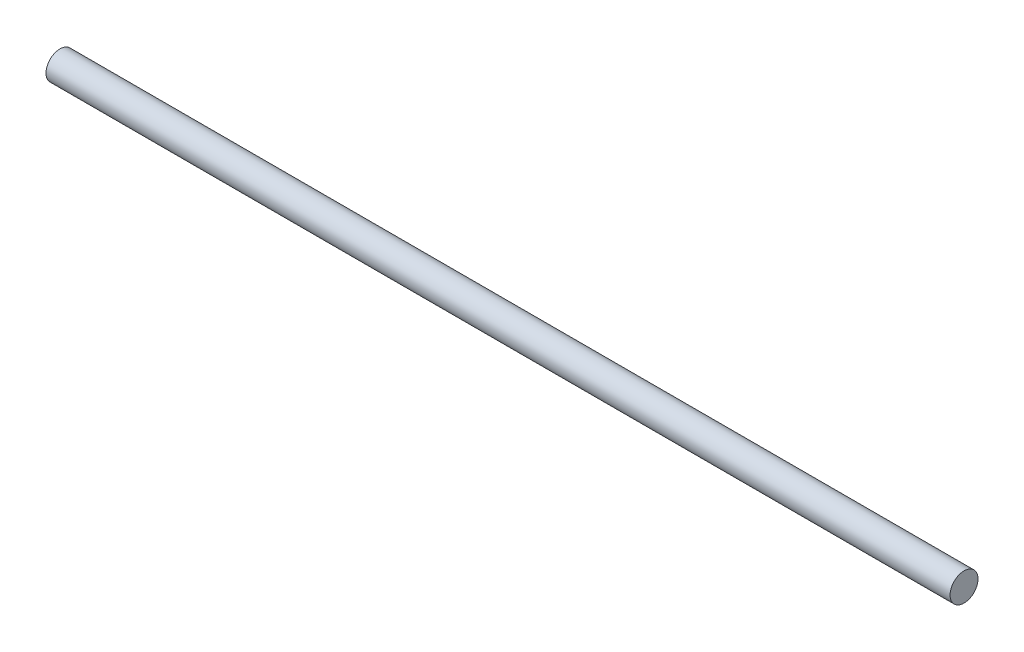
ISO-10303-21;
HEADER;
FILE_DESCRIPTION(('STEP AP214'),'2;1');
FILE_NAME('part.step','',(''),(''),'','','');
FILE_SCHEMA(('AUTOMOTIVE_DESIGN { 1 0 10303 214 1 1 1 1 }'));
ENDSEC;
DATA;
#1=APPLICATION_CONTEXT('core data for automotive mechanical design processes');
#2=APPLICATION_PROTOCOL_DEFINITION('international standard','automotive_design',2000,#1);
#3=PRODUCT_CONTEXT('',#1,'mechanical');
#4=PRODUCT('Part','Part','',(#3));
#5=PRODUCT_RELATED_PRODUCT_CATEGORY('part','',(#4));
#6=PRODUCT_DEFINITION_FORMATION('','',#4);
#7=PRODUCT_DEFINITION_CONTEXT('part definition',#1,'design');
#8=PRODUCT_DEFINITION('design','',#6,#7);
#9=PRODUCT_DEFINITION_SHAPE('','',#8);
#10=(LENGTH_UNIT() NAMED_UNIT(*) SI_UNIT(.MILLI.,.METRE.));
#11=(NAMED_UNIT(*) PLANE_ANGLE_UNIT() SI_UNIT($,.RADIAN.));
#12=(NAMED_UNIT(*) SI_UNIT($,.STERADIAN.) SOLID_ANGLE_UNIT());
#13=UNCERTAINTY_MEASURE_WITH_UNIT(LENGTH_MEASURE(1.E-05),#10,'distance_accuracy_value','');
#14=(GEOMETRIC_REPRESENTATION_CONTEXT(3) GLOBAL_UNCERTAINTY_ASSIGNED_CONTEXT((#13)) GLOBAL_UNIT_ASSIGNED_CONTEXT((#10,
#11,#12)) REPRESENTATION_CONTEXT('',''));
#15=CARTESIAN_POINT('',(0.,0.,0.));
#16=DIRECTION('',(0.,0.,1.));
#17=DIRECTION('',(1.,0.,0.));
#18=AXIS2_PLACEMENT_3D('',#15,#16,#17);
#19=CARTESIAN_POINT('',(97.,0.,0.));
#20=DIRECTION('',(-1.,0.,0.));
#21=DIRECTION('',(0.,0.,1.));
#22=AXIS2_PLACEMENT_3D('',#19,#20,#21);
#23=CYLINDRICAL_SURFACE('',#22,1.5);
#24=CARTESIAN_POINT('',(97.,0.,0.));
#25=DIRECTION('',(1.,0.,0.));
#26=DIRECTION('',(0.,0.,-1.));
#27=AXIS2_PLACEMENT_3D('',#24,#25,#26);
#28=CIRCLE('',#27,1.5);
#29=CARTESIAN_POINT('',(97.,0.,1.5));
#30=VERTEX_POINT('',#29);
#31=EDGE_CURVE('E10',#30,#30,#28,.T.);
#32=CARTESIAN_POINT('',(0.,0.,0.));
#33=DIRECTION('',(1.,0.,0.));
#34=DIRECTION('',(0.,0.,-1.));
#35=AXIS2_PLACEMENT_3D('',#32,#33,#34);
#36=CIRCLE('',#35,1.5);
#37=CARTESIAN_POINT('',(0.,0.,1.5));
#38=VERTEX_POINT('',#37);
#39=EDGE_CURVE('E34',#38,#38,#36,.T.);
#40=CARTESIAN_POINT('',(97.,0.,1.5));
#41=CARTESIAN_POINT('',(95.9895833333333,0.,1.5));
#42=CARTESIAN_POINT('',(94.9791666666667,0.,1.5));
#43=CARTESIAN_POINT('',(92.9583333333333,0.,1.5));
#44=CARTESIAN_POINT('',(91.9479166666667,0.,1.5));
#45=CARTESIAN_POINT('',(89.9270833333333,0.,1.5));
#46=CARTESIAN_POINT('',(88.9166666666667,0.,1.5));
#47=CARTESIAN_POINT('',(86.8958333333333,0.,1.5));
#48=CARTESIAN_POINT('',(85.8854166666667,0.,1.5));
#49=CARTESIAN_POINT('',(83.8645833333333,0.,1.5));
#50=CARTESIAN_POINT('',(82.8541666666667,0.,1.5));
#51=CARTESIAN_POINT('',(80.8333333333333,0.,1.5));
#52=CARTESIAN_POINT('',(79.8229166666667,0.,1.5));
#53=CARTESIAN_POINT('',(77.8020833333333,0.,1.5));
#54=CARTESIAN_POINT('',(76.7916666666667,0.,1.5));
#55=CARTESIAN_POINT('',(74.7708333333333,0.,1.5));
#56=CARTESIAN_POINT('',(73.7604166666667,0.,1.5));
#57=CARTESIAN_POINT('',(71.7395833333333,0.,1.5));
#58=CARTESIAN_POINT('',(70.7291666666667,0.,1.5));
#59=CARTESIAN_POINT('',(68.7083333333333,0.,1.5));
#60=CARTESIAN_POINT('',(67.6979166666666,0.,1.5));
#61=CARTESIAN_POINT('',(65.6770833333333,0.,1.5));
#62=CARTESIAN_POINT('',(64.6666666666667,0.,1.5));
#63=CARTESIAN_POINT('',(62.6458333333333,0.,1.5));
#64=CARTESIAN_POINT('',(61.6354166666667,0.,1.5));
#65=CARTESIAN_POINT('',(59.6145833333333,0.,1.5));
#66=CARTESIAN_POINT('',(58.6041666666667,0.,1.5));
#67=CARTESIAN_POINT('',(56.5833333333333,0.,1.5));
#68=CARTESIAN_POINT('',(55.5729166666667,0.,1.5));
#69=CARTESIAN_POINT('',(53.5520833333333,0.,1.5));
#70=CARTESIAN_POINT('',(52.5416666666667,0.,1.5));
#71=CARTESIAN_POINT('',(50.5208333333333,0.,1.5));
#72=CARTESIAN_POINT('',(49.5104166666667,0.,1.5));
#73=CARTESIAN_POINT('',(47.4895833333333,0.,1.5));
#74=CARTESIAN_POINT('',(46.4791666666667,0.,1.5));
#75=CARTESIAN_POINT('',(44.4583333333333,0.,1.5));
#76=CARTESIAN_POINT('',(43.4479166666667,0.,1.5));
#77=CARTESIAN_POINT('',(41.4270833333333,0.,1.5));
#78=CARTESIAN_POINT('',(40.4166666666667,0.,1.5));
#79=CARTESIAN_POINT('',(38.3958333333333,0.,1.5));
#80=CARTESIAN_POINT('',(37.3854166666667,0.,1.5));
#81=CARTESIAN_POINT('',(35.3645833333333,0.,1.5));
#82=CARTESIAN_POINT('',(34.3541666666667,0.,1.5));
#83=CARTESIAN_POINT('',(32.3333333333333,0.,1.5));
#84=CARTESIAN_POINT('',(31.3229166666667,0.,1.5));
#85=CARTESIAN_POINT('',(29.3020833333333,0.,1.5));
#86=CARTESIAN_POINT('',(28.2916666666667,0.,1.5));
#87=CARTESIAN_POINT('',(26.2708333333333,0.,1.5));
#88=CARTESIAN_POINT('',(25.2604166666667,0.,1.5));
#89=CARTESIAN_POINT('',(23.2395833333333,0.,1.5));
#90=CARTESIAN_POINT('',(22.2291666666667,0.,1.5));
#91=CARTESIAN_POINT('',(20.2083333333333,0.,1.5));
#92=CARTESIAN_POINT('',(19.1979166666667,0.,1.5));
#93=CARTESIAN_POINT('',(17.1770833333333,0.,1.5));
#94=CARTESIAN_POINT('',(16.1666666666667,0.,1.5));
#95=CARTESIAN_POINT('',(14.1458333333333,0.,1.5));
#96=CARTESIAN_POINT('',(13.1354166666667,0.,1.5));
#97=CARTESIAN_POINT('',(11.1145833333333,0.,1.5));
#98=CARTESIAN_POINT('',(10.1041666666667,0.,1.5));
#99=CARTESIAN_POINT('',(8.08333333333332,0.,1.5));
#100=CARTESIAN_POINT('',(7.07291666666665,0.,1.5));
#101=CARTESIAN_POINT('',(5.05208333333332,0.,1.5));
#102=CARTESIAN_POINT('',(4.04166666666665,0.,1.5));
#103=CARTESIAN_POINT('',(2.02083333333332,0.,1.5));
#104=CARTESIAN_POINT('',(1.01041666666665,0.,1.5));
#105=CARTESIAN_POINT('',(0.,0.,1.5));
#106=B_SPLINE_CURVE_WITH_KNOTS('',3,(#40,#41,#42,#43,#44,#45,#46,#47,#48,#49,#50,#51,#52,#53,
#54,#55,#56,#57,#58,#59,#60,#61,#62,#63,#64,#65,#66,#67,#68,#69,#70,#71,#72,#73,#74,#75,#76,#77,
#78,#79,#80,#81,#82,#83,#84,#85,#86,#87,#88,#89,#90,#91,#92,#93,#94,#95,#96,#97,#98,#99,#100,
#101,#102,#103,#104,#105),.UNSPECIFIED.,.F.,.F.,(4,2,2,2,2,2,2,2,2,2,2,2,2,2,2,2,2,2,2,2,2,2,2,
2,2,2,2,2,2,2,2,2,4),(0.,3.03125000000001,6.06250000000001,9.09375000000001,12.125,15.15625,
18.1875,21.21875,24.25,27.28125,30.3125,33.34375,36.375,39.40625,42.4375,45.46875,48.5,51.53125,
54.5625,57.59375,60.625,63.65625,66.6875,69.71875,72.75,75.78125,78.8125,81.84375,84.875,
87.90625,90.9375,93.96875,97.),.UNSPECIFIED.);
#107=EDGE_CURVE('BSEAM31',#30,#38,#106,.T.);
#108=ORIENTED_EDGE('',*,*,#31,.F.);
#109=ORIENTED_EDGE('',*,*,#39,.T.);
#110=ORIENTED_EDGE('',*,*,#107,.T.);
#111=ORIENTED_EDGE('',*,*,#107,.F.);
#112=EDGE_LOOP('',(#108,#110,#109,#111));
#113=FACE_BOUND('',#112,.T.);
#114=ADVANCED_FACE('F31',(#113),#23,.T.);
#115=CARTESIAN_POINT('',(97.,0.,0.));
#116=DIRECTION('',(1.,0.,0.));
#117=DIRECTION('',(0.,0.,-1.));
#118=AXIS2_PLACEMENT_3D('',#115,#116,#117);
#119=PLANE('',#118);
#120=ORIENTED_EDGE('',*,*,#31,.T.);
#121=EDGE_LOOP('',(#120));
#122=FACE_BOUND('',#121,.T.);
#123=ADVANCED_FACE('F46',(#122),#119,.T.);
#124=CARTESIAN_POINT('',(0.,0.,0.));
#125=DIRECTION('',(1.,0.,0.));
#126=DIRECTION('',(0.,0.,-1.));
#127=AXIS2_PLACEMENT_3D('',#124,#125,#126);
#128=PLANE('',#127);
#129=ORIENTED_EDGE('',*,*,#39,.F.);
#130=EDGE_LOOP('',(#129));
#131=FACE_BOUND('',#130,.T.);
#132=ADVANCED_FACE('F44',(#131),#128,.F.);
#133=CLOSED_SHELL('',(#114,#123,#132));
#134=MANIFOLD_SOLID_BREP('B2',#133);
#135=ADVANCED_BREP_SHAPE_REPRESENTATION('',(#18,#134),#14);
#136=SHAPE_DEFINITION_REPRESENTATION(#9,#135);
ENDSEC;
END-ISO-10303-21;
